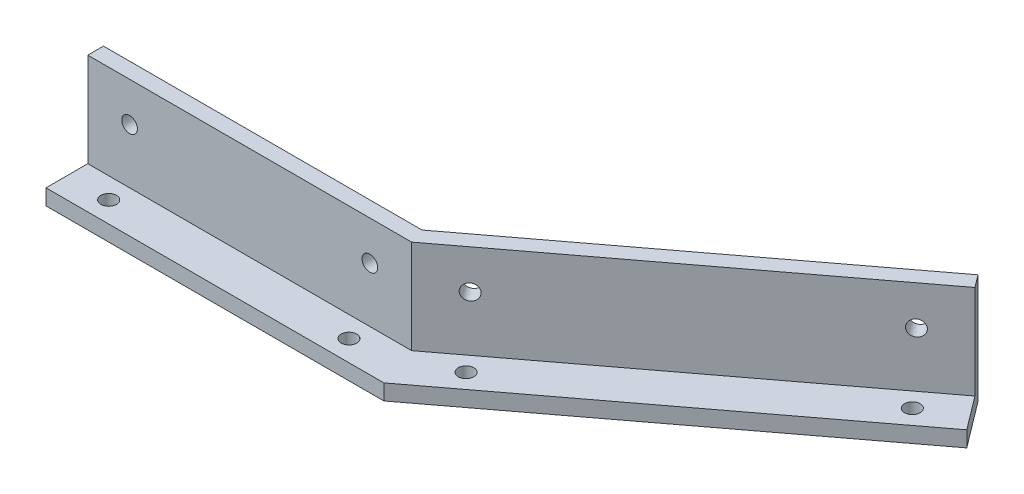
ISO-10303-21;
HEADER;
FILE_DESCRIPTION(('STEP AP214'),'2;1');
FILE_NAME('part.step','',(''),(''),'','','');
FILE_SCHEMA(('AUTOMOTIVE_DESIGN { 1 0 10303 214 1 1 1 1 }'));
ENDSEC;
DATA;
#1=APPLICATION_CONTEXT('core data for automotive mechanical design processes');
#2=APPLICATION_PROTOCOL_DEFINITION('international standard','automotive_design',2000,#1);
#3=PRODUCT_CONTEXT('',#1,'mechanical');
#4=PRODUCT('Part','Part','',(#3));
#5=PRODUCT_RELATED_PRODUCT_CATEGORY('part','',(#4));
#6=PRODUCT_DEFINITION_FORMATION('','',#4);
#7=PRODUCT_DEFINITION_CONTEXT('part definition',#1,'design');
#8=PRODUCT_DEFINITION('design','',#6,#7);
#9=PRODUCT_DEFINITION_SHAPE('','',#8);
#10=(LENGTH_UNIT() NAMED_UNIT(*) SI_UNIT(.MILLI.,.METRE.));
#11=(NAMED_UNIT(*) PLANE_ANGLE_UNIT() SI_UNIT($,.RADIAN.));
#12=(NAMED_UNIT(*) SI_UNIT($,.STERADIAN.) SOLID_ANGLE_UNIT());
#13=UNCERTAINTY_MEASURE_WITH_UNIT(LENGTH_MEASURE(1.E-05),#10,'distance_accuracy_value','');
#14=(GEOMETRIC_REPRESENTATION_CONTEXT(3) GLOBAL_UNCERTAINTY_ASSIGNED_CONTEXT((#13)) GLOBAL_UNIT_ASSIGNED_CONTEXT((#10,
#11,#12)) REPRESENTATION_CONTEXT('',''));
#15=CARTESIAN_POINT('',(0.,0.,0.));
#16=DIRECTION('',(0.,0.,1.));
#17=DIRECTION('',(1.,0.,0.));
#18=AXIS2_PLACEMENT_3D('',#15,#16,#17);
#19=CARTESIAN_POINT('',(0.,3.,0.));
#20=DIRECTION('',(1.,0.,0.));
#21=DIRECTION('',(0.,0.,-1.));
#22=AXIS2_PLACEMENT_3D('',#19,#20,#21);
#23=PLANE('',#22);
#24=DIRECTION('',(0.,0.,1.));
#25=VECTOR('',#24,1.);
#26=CARTESIAN_POINT('',(0.,0.,0.));
#27=LINE('',#26,#25);
#28=CARTESIAN_POINT('',(0.,0.,-3.));
#29=VERTEX_POINT('',#28);
#30=CARTESIAN_POINT('',(0.,0.,8.));
#31=VERTEX_POINT('',#30);
#32=EDGE_CURVE('E135',#29,#31,#27,.T.);
#33=ORIENTED_EDGE('',*,*,#32,.T.);
#34=DIRECTION('',(0.,-1.,0.));
#35=VECTOR('',#34,1.);
#36=CARTESIAN_POINT('',(0.,3.,8.));
#37=LINE('',#36,#35);
#38=CARTESIAN_POINT('',(0.,3.,8.));
#39=VERTEX_POINT('',#38);
#40=EDGE_CURVE('E11',#39,#31,#37,.T.);
#41=ORIENTED_EDGE('',*,*,#40,.F.);
#42=DIRECTION('',(0.,0.,1.));
#43=VECTOR('',#42,1.);
#44=CARTESIAN_POINT('',(0.,3.,0.));
#45=LINE('',#44,#43);
#46=CARTESIAN_POINT('',(0.,3.,0.));
#47=VERTEX_POINT('',#46);
#48=EDGE_CURVE('E144',#47,#39,#45,.T.);
#49=ORIENTED_EDGE('',*,*,#48,.F.);
#50=DIRECTION('',(0.,-1.,0.));
#51=VECTOR('',#50,1.);
#52=CARTESIAN_POINT('',(0.,21.,0.));
#53=LINE('',#52,#51);
#54=CARTESIAN_POINT('',(0.,21.,0.));
#55=VERTEX_POINT('',#54);
#56=EDGE_CURVE('E192',#55,#47,#53,.T.);
#57=ORIENTED_EDGE('',*,*,#56,.F.);
#58=DIRECTION('',(0.,0.,1.));
#59=VECTOR('',#58,1.);
#60=CARTESIAN_POINT('',(0.,21.,0.));
#61=LINE('',#60,#59);
#62=CARTESIAN_POINT('',(0.,21.,-3.));
#63=VERTEX_POINT('',#62);
#64=EDGE_CURVE('E184',#63,#55,#61,.T.);
#65=ORIENTED_EDGE('',*,*,#64,.F.);
#66=DIRECTION('',(0.,-1.,0.));
#67=VECTOR('',#66,1.);
#68=CARTESIAN_POINT('',(0.,21.,-3.));
#69=LINE('',#68,#67);
#70=EDGE_CURVE('E195',#63,#29,#69,.T.);
#71=ORIENTED_EDGE('',*,*,#70,.T.);
#72=EDGE_LOOP('',(#33,#41,#49,#57,#65,#71));
#73=FACE_BOUND('',#72,.T.);
#74=ADVANCED_FACE('F35',(#73),#23,.F.);
#75=CARTESIAN_POINT('',(0.,3.,8.));
#76=DIRECTION('',(0.,0.,-1.));
#77=DIRECTION('',(-1.,0.,0.));
#78=AXIS2_PLACEMENT_3D('',#75,#76,#77);
#79=PLANE('',#78);
#80=DIRECTION('',(1.,0.,0.));
#81=VECTOR('',#80,1.);
#82=CARTESIAN_POINT('',(0.,0.,8.));
#83=LINE('',#82,#81);
#84=CARTESIAN_POINT('',(64.6810803346857,0.,8.));
#85=VERTEX_POINT('',#84);
#86=EDGE_CURVE('E64',#31,#85,#83,.T.);
#87=ORIENTED_EDGE('',*,*,#86,.T.);
#88=DIRECTION('',(0.,-1.,0.));
#89=VECTOR('',#88,1.);
#90=CARTESIAN_POINT('',(64.6810803346857,3.,8.));
#91=LINE('',#90,#89);
#92=CARTESIAN_POINT('',(64.6810803346857,3.,8.));
#93=VERTEX_POINT('',#92);
#94=EDGE_CURVE('E43',#93,#85,#91,.T.);
#95=ORIENTED_EDGE('',*,*,#94,.F.);
#96=DIRECTION('',(1.,0.,0.));
#97=VECTOR('',#96,1.);
#98=CARTESIAN_POINT('',(0.,3.,8.));
#99=LINE('',#98,#97);
#100=EDGE_CURVE('E77',#39,#93,#99,.T.);
#101=ORIENTED_EDGE('',*,*,#100,.F.);
#102=ORIENTED_EDGE('',*,*,#40,.T.);
#103=EDGE_LOOP('',(#87,#95,#101,#102));
#104=FACE_BOUND('',#103,.T.);
#105=ADVANCED_FACE('F242',(#104),#79,.F.);
#106=CARTESIAN_POINT('',(64.6810803346857,3.,8.));
#107=DIRECTION('',(-0.602589900007111,0.,-0.798051008651339));
#108=DIRECTION('',(-0.798051008651339,0.,0.602589900007111));
#109=AXIS2_PLACEMENT_3D('',#106,#107,#108);
#110=PLANE('',#109);
#111=DIRECTION('',(0.798051008651339,0.,-0.602589900007111));
#112=VECTOR('',#111,1.);
#113=CARTESIAN_POINT('',(64.6810803346857,0.,8.));
#114=LINE('',#113,#112);
#115=CARTESIAN_POINT('',(128.27064686621,0.,-40.0150142313369));
#116=VERTEX_POINT('',#115);
#117=EDGE_CURVE('E71',#85,#116,#114,.T.);
#118=ORIENTED_EDGE('',*,*,#117,.T.);
#119=DIRECTION('',(0.,-1.,0.));
#120=VECTOR('',#119,1.);
#121=CARTESIAN_POINT('',(128.27064686621,3.,-40.0150142313369));
#122=LINE('',#121,#120);
#123=CARTESIAN_POINT('',(128.27064686621,3.,-40.0150142313369));
#124=VERTEX_POINT('',#123);
#125=EDGE_CURVE('E150',#124,#116,#122,.T.);
#126=ORIENTED_EDGE('',*,*,#125,.F.);
#127=DIRECTION('',(0.798051008651339,0.,-0.602589900007111));
#128=VECTOR('',#127,1.);
#129=CARTESIAN_POINT('',(64.6810803346857,3.,8.));
#130=LINE('',#129,#128);
#131=EDGE_CURVE('E91',#93,#124,#130,.T.);
#132=ORIENTED_EDGE('',*,*,#131,.F.);
#133=ORIENTED_EDGE('',*,*,#94,.T.);
#134=EDGE_LOOP('',(#118,#126,#132,#133));
#135=FACE_BOUND('',#134,.T.);
#136=ADVANCED_FACE('F156',(#135),#110,.F.);
#137=CARTESIAN_POINT('',(128.27064686621,3.,-40.0150142313369));
#138=DIRECTION('',(-0.798051008651335,0.,0.602589900007116));
#139=DIRECTION('',(0.602589900007117,0.,0.798051008651335));
#140=AXIS2_PLACEMENT_3D('',#137,#138,#139);
#141=PLANE('',#140);
#142=DIRECTION('',(-0.602589900007116,0.,-0.798051008651335));
#143=VECTOR('',#142,1.);
#144=CARTESIAN_POINT('',(128.27064686621,0.,-40.0150142313369));
#145=LINE('',#144,#143);
#146=CARTESIAN_POINT('',(121.642157966132,0.,-48.7935753265016));
#147=VERTEX_POINT('',#146);
#148=EDGE_CURVE('E146',#116,#147,#145,.T.);
#149=ORIENTED_EDGE('',*,*,#148,.T.);
#150=DIRECTION('',(0.,-1.,0.));
#151=VECTOR('',#150,1.);
#152=CARTESIAN_POINT('',(121.642157966132,21.,-48.7935753265016));
#153=LINE('',#152,#151);
#154=CARTESIAN_POINT('',(121.642157966132,21.,-48.7935753265016));
#155=VERTEX_POINT('',#154);
#156=EDGE_CURVE('E111',#155,#147,#153,.T.);
#157=ORIENTED_EDGE('',*,*,#156,.F.);
#158=DIRECTION('',(-0.602589900007116,0.,-0.798051008651335));
#159=VECTOR('',#158,1.);
#160=CARTESIAN_POINT('',(123.449927666153,21.,-46.3994223005476));
#161=LINE('',#160,#159);
#162=CARTESIAN_POINT('',(123.449927666153,21.,-46.3994223005476));
#163=VERTEX_POINT('',#162);
#164=EDGE_CURVE('E110',#163,#155,#161,.T.);
#165=ORIENTED_EDGE('',*,*,#164,.F.);
#166=DIRECTION('',(0.,-1.,0.));
#167=VECTOR('',#166,1.);
#168=CARTESIAN_POINT('',(123.449927666153,21.,-46.3994223005476));
#169=LINE('',#168,#167);
#170=CARTESIAN_POINT('',(123.449927666153,3.,-46.3994223005476));
#171=VERTEX_POINT('',#170);
#172=EDGE_CURVE('E101',#163,#171,#169,.T.);
#173=ORIENTED_EDGE('',*,*,#172,.T.);
#174=DIRECTION('',(-0.602589900007116,0.,-0.798051008651335));
#175=VECTOR('',#174,1.);
#176=CARTESIAN_POINT('',(128.27064686621,3.,-40.0150142313369));
#177=LINE('',#176,#175);
#178=EDGE_CURVE('E86',#124,#171,#177,.T.);
#179=ORIENTED_EDGE('',*,*,#178,.F.);
#180=ORIENTED_EDGE('',*,*,#125,.T.);
#181=EDGE_LOOP('',(#149,#157,#165,#173,#179,#180));
#182=FACE_BOUND('',#181,.T.);
#183=ADVANCED_FACE('F107',(#182),#141,.F.);
#184=CARTESIAN_POINT('',(0.,3.,0.));
#185=DIRECTION('',(0.,1.,0.));
#186=DIRECTION('',(0.,0.,1.));
#187=AXIS2_PLACEMENT_3D('',#184,#185,#186);
#188=PLANE('',#187);
#189=CARTESIAN_POINT('',(70.7947676692392,3.,-1.62851516545155));
#190=DIRECTION('',(0.,1.,0.));
#191=DIRECTION('',(0.,0.,1.));
#192=AXIS2_PLACEMENT_3D('',#189,#190,#191);
#193=CIRCLE('',#192,1.5);
#194=CARTESIAN_POINT('',(70.7947676692392,3.,-0.128515165451554));
#195=VERTEX_POINT('',#194);
#196=EDGE_CURVE('E124',#195,#195,#193,.T.);
#197=ORIENTED_EDGE('',*,*,#196,.F.);
#198=EDGE_LOOP('',(#197));
#199=FACE_BOUND('',#198,.T.);
#200=CARTESIAN_POINT('',(119.475879196971,3.,-38.3864990658853));
#201=DIRECTION('',(0.,1.,0.));
#202=DIRECTION('',(0.,0.,1.));
#203=AXIS2_PLACEMENT_3D('',#200,#201,#202);
#204=CIRCLE('',#203,1.5);
#205=CARTESIAN_POINT('',(119.475879196971,3.,-36.8864990658853));
#206=VERTEX_POINT('',#205);
#207=EDGE_CURVE('E113',#206,#206,#204,.T.);
#208=ORIENTED_EDGE('',*,*,#207,.F.);
#209=EDGE_LOOP('',(#208));
#210=FACE_BOUND('',#209,.T.);
#211=CARTESIAN_POINT('',(8.,3.,4.));
#212=DIRECTION('',(0.,1.,0.));
#213=DIRECTION('',(0.,0.,1.));
#214=AXIS2_PLACEMENT_3D('',#211,#212,#213);
#215=CIRCLE('',#214,1.5);
#216=CARTESIAN_POINT('',(8.,3.,5.5));
#217=VERTEX_POINT('',#216);
#218=EDGE_CURVE('E136',#217,#217,#215,.T.);
#219=ORIENTED_EDGE('',*,*,#218,.F.);
#220=EDGE_LOOP('',(#219));
#221=FACE_BOUND('',#220,.T.);
#222=CARTESIAN_POINT('',(54.,3.,4.));
#223=DIRECTION('',(0.,1.,0.));
#224=DIRECTION('',(0.,0.,1.));
#225=AXIS2_PLACEMENT_3D('',#222,#223,#224);
#226=CIRCLE('',#225,1.5);
#227=CARTESIAN_POINT('',(54.,3.,5.5));
#228=VERTEX_POINT('',#227);
#229=EDGE_CURVE('E123',#228,#228,#226,.T.);
#230=ORIENTED_EDGE('',*,*,#229,.F.);
#231=EDGE_LOOP('',(#230));
#232=FACE_BOUND('',#231,.T.);
#233=ORIENTED_EDGE('',*,*,#48,.T.);
#234=ORIENTED_EDGE('',*,*,#100,.T.);
#235=ORIENTED_EDGE('',*,*,#131,.T.);
#236=ORIENTED_EDGE('',*,*,#178,.T.);
#237=DIRECTION('',(-0.798051008651339,0.,0.602589900007111));
#238=VECTOR('',#237,1.);
#239=CARTESIAN_POINT('',(62.,3.,0.));
#240=LINE('',#239,#238);
#241=CARTESIAN_POINT('',(62.,3.,0.));
#242=VERTEX_POINT('',#241);
#243=EDGE_CURVE('E89',#171,#242,#240,.T.);
#244=ORIENTED_EDGE('',*,*,#243,.T.);
#245=DIRECTION('',(-1.,0.,0.));
#246=VECTOR('',#245,1.);
#247=CARTESIAN_POINT('',(0.,3.,0.));
#248=LINE('',#247,#246);
#249=EDGE_CURVE('E51',#242,#47,#248,.T.);
#250=ORIENTED_EDGE('',*,*,#249,.T.);
#251=EDGE_LOOP('',(#233,#234,#235,#236,#244,#250));
#252=FACE_BOUND('',#251,.T.);
#253=ADVANCED_FACE('F88',(#199,#210,#221,#232,#252),#188,.T.);
#254=CARTESIAN_POINT('',(0.,0.,0.));
#255=DIRECTION('',(0.,1.,0.));
#256=DIRECTION('',(0.,0.,1.));
#257=AXIS2_PLACEMENT_3D('',#254,#255,#256);
#258=PLANE('',#257);
#259=ORIENTED_EDGE('',*,*,#32,.F.);
#260=DIRECTION('',(-1.,0.,0.));
#261=VECTOR('',#260,1.);
#262=CARTESIAN_POINT('',(0.,0.,-3.));
#263=LINE('',#262,#261);
#264=CARTESIAN_POINT('',(60.9945948744929,0.,-3.));
#265=VERTEX_POINT('',#264);
#266=EDGE_CURVE('E202',#265,#29,#263,.T.);
#267=ORIENTED_EDGE('',*,*,#266,.F.);
#268=DIRECTION('',(-0.798051008651339,0.,0.602589900007111));
#269=VECTOR('',#268,1.);
#270=CARTESIAN_POINT('',(121.642157966132,0.,-48.7935753265016));
#271=LINE('',#270,#269);
#272=EDGE_CURVE('E166',#147,#265,#271,.T.);
#273=ORIENTED_EDGE('',*,*,#272,.F.);
#274=ORIENTED_EDGE('',*,*,#148,.F.);
#275=ORIENTED_EDGE('',*,*,#117,.F.);
#276=ORIENTED_EDGE('',*,*,#86,.F.);
#277=EDGE_LOOP('',(#259,#267,#273,#274,#275,#276));
#278=FACE_BOUND('',#277,.T.);
#279=CARTESIAN_POINT('',(70.7947676692392,0.,-1.62851516545155));
#280=DIRECTION('',(0.,1.,0.));
#281=DIRECTION('',(0.,0.,1.));
#282=AXIS2_PLACEMENT_3D('',#279,#280,#281);
#283=CIRCLE('',#282,1.5);
#284=CARTESIAN_POINT('',(70.7947676692392,0.,-0.128515165451554));
#285=VERTEX_POINT('',#284);
#286=EDGE_CURVE('E120',#285,#285,#283,.T.);
#287=ORIENTED_EDGE('',*,*,#286,.T.);
#288=EDGE_LOOP('',(#287));
#289=FACE_BOUND('',#288,.T.);
#290=CARTESIAN_POINT('',(119.475879196971,0.,-38.3864990658853));
#291=DIRECTION('',(0.,1.,0.));
#292=DIRECTION('',(0.,0.,1.));
#293=AXIS2_PLACEMENT_3D('',#290,#291,#292);
#294=CIRCLE('',#293,1.5);
#295=CARTESIAN_POINT('',(119.475879196971,0.,-36.8864990658853));
#296=VERTEX_POINT('',#295);
#297=EDGE_CURVE('E127',#296,#296,#294,.T.);
#298=ORIENTED_EDGE('',*,*,#297,.T.);
#299=EDGE_LOOP('',(#298));
#300=FACE_BOUND('',#299,.T.);
#301=CARTESIAN_POINT('',(8.,0.,4.));
#302=DIRECTION('',(0.,1.,0.));
#303=DIRECTION('',(0.,0.,1.));
#304=AXIS2_PLACEMENT_3D('',#301,#302,#303);
#305=CIRCLE('',#304,1.5);
#306=CARTESIAN_POINT('',(8.,0.,5.5));
#307=VERTEX_POINT('',#306);
#308=EDGE_CURVE('E132',#307,#307,#305,.T.);
#309=ORIENTED_EDGE('',*,*,#308,.T.);
#310=EDGE_LOOP('',(#309));
#311=FACE_BOUND('',#310,.T.);
#312=CARTESIAN_POINT('',(54.,0.,4.));
#313=DIRECTION('',(0.,1.,0.));
#314=DIRECTION('',(0.,0.,1.));
#315=AXIS2_PLACEMENT_3D('',#312,#313,#314);
#316=CIRCLE('',#315,1.5);
#317=CARTESIAN_POINT('',(54.,0.,5.5));
#318=VERTEX_POINT('',#317);
#319=EDGE_CURVE('E139',#318,#318,#316,.T.);
#320=ORIENTED_EDGE('',*,*,#319,.T.);
#321=EDGE_LOOP('',(#320));
#322=FACE_BOUND('',#321,.T.);
#323=ADVANCED_FACE('F160',(#278,#289,#300,#311,#322),#258,.F.);
#324=CARTESIAN_POINT('',(54.,0.,4.));
#325=DIRECTION('',(0.,1.,0.));
#326=DIRECTION('',(0.,0.,1.));
#327=AXIS2_PLACEMENT_3D('',#324,#325,#326);
#328=CYLINDRICAL_SURFACE('',#327,1.5);
#329=ORIENTED_EDGE('',*,*,#319,.F.);
#330=EDGE_LOOP('',(#329));
#331=FACE_BOUND('',#330,.T.);
#332=ORIENTED_EDGE('',*,*,#229,.T.);
#333=EDGE_LOOP('',(#332));
#334=FACE_BOUND('',#333,.T.);
#335=ADVANCED_FACE('F255',(#331,#334),#328,.F.);
#336=CARTESIAN_POINT('',(8.,0.,4.));
#337=DIRECTION('',(0.,1.,0.));
#338=DIRECTION('',(0.,0.,1.));
#339=AXIS2_PLACEMENT_3D('',#336,#337,#338);
#340=CYLINDRICAL_SURFACE('',#339,1.5);
#341=ORIENTED_EDGE('',*,*,#308,.F.);
#342=EDGE_LOOP('',(#341));
#343=FACE_BOUND('',#342,.T.);
#344=ORIENTED_EDGE('',*,*,#218,.T.);
#345=EDGE_LOOP('',(#344));
#346=FACE_BOUND('',#345,.T.);
#347=ADVANCED_FACE('F261',(#343,#346),#340,.F.);
#348=CARTESIAN_POINT('',(119.475879196971,0.,-38.3864990658853));
#349=DIRECTION('',(0.,1.,0.));
#350=DIRECTION('',(0.,0.,1.));
#351=AXIS2_PLACEMENT_3D('',#348,#349,#350);
#352=CYLINDRICAL_SURFACE('',#351,1.5);
#353=ORIENTED_EDGE('',*,*,#297,.F.);
#354=EDGE_LOOP('',(#353));
#355=FACE_BOUND('',#354,.T.);
#356=ORIENTED_EDGE('',*,*,#207,.T.);
#357=EDGE_LOOP('',(#356));
#358=FACE_BOUND('',#357,.T.);
#359=ADVANCED_FACE('F236',(#355,#358),#352,.F.);
#360=CARTESIAN_POINT('',(70.7947676692392,0.,-1.62851516545155));
#361=DIRECTION('',(0.,1.,0.));
#362=DIRECTION('',(0.,0.,1.));
#363=AXIS2_PLACEMENT_3D('',#360,#361,#362);
#364=CYLINDRICAL_SURFACE('',#363,1.5);
#365=ORIENTED_EDGE('',*,*,#286,.F.);
#366=EDGE_LOOP('',(#365));
#367=FACE_BOUND('',#366,.T.);
#368=ORIENTED_EDGE('',*,*,#196,.T.);
#369=EDGE_LOOP('',(#368));
#370=FACE_BOUND('',#369,.T.);
#371=ADVANCED_FACE('F227',(#367,#370),#364,.F.);
#372=CARTESIAN_POINT('',(0.,21.,0.));
#373=DIRECTION('',(0.,0.,-1.));
#374=DIRECTION('',(-1.,0.,0.));
#375=AXIS2_PLACEMENT_3D('',#372,#373,#374);
#376=PLANE('',#375);
#377=CARTESIAN_POINT('',(8.,13.5,0.));
#378=DIRECTION('',(0.,0.,1.));
#379=DIRECTION('',(1.,0.,0.));
#380=AXIS2_PLACEMENT_3D('',#377,#378,#379);
#381=CIRCLE('',#380,1.5);
#382=CARTESIAN_POINT('',(9.5,13.5,0.));
#383=VERTEX_POINT('',#382);
#384=EDGE_CURVE('E415',#383,#383,#381,.T.);
#385=ORIENTED_EDGE('',*,*,#384,.F.);
#386=EDGE_LOOP('',(#385));
#387=FACE_BOUND('',#386,.T.);
#388=CARTESIAN_POINT('',(54.,13.5,0.));
#389=DIRECTION('',(0.,0.,1.));
#390=DIRECTION('',(1.,0.,0.));
#391=AXIS2_PLACEMENT_3D('',#388,#389,#390);
#392=CIRCLE('',#391,1.5);
#393=CARTESIAN_POINT('',(55.5,13.5,0.));
#394=VERTEX_POINT('',#393);
#395=EDGE_CURVE('E405',#394,#394,#392,.T.);
#396=ORIENTED_EDGE('',*,*,#395,.F.);
#397=EDGE_LOOP('',(#396));
#398=FACE_BOUND('',#397,.T.);
#399=ORIENTED_EDGE('',*,*,#249,.F.);
#400=DIRECTION('',(0.,-1.,0.));
#401=VECTOR('',#400,1.);
#402=CARTESIAN_POINT('',(62.,21.,0.));
#403=LINE('',#402,#401);
#404=CARTESIAN_POINT('',(62.,21.,0.));
#405=VERTEX_POINT('',#404);
#406=EDGE_CURVE('E104',#405,#242,#403,.T.);
#407=ORIENTED_EDGE('',*,*,#406,.F.);
#408=DIRECTION('',(1.,0.,0.));
#409=VECTOR('',#408,1.);
#410=CARTESIAN_POINT('',(0.,21.,0.));
#411=LINE('',#410,#409);
#412=EDGE_CURVE('E204',#55,#405,#411,.T.);
#413=ORIENTED_EDGE('',*,*,#412,.F.);
#414=ORIENTED_EDGE('',*,*,#56,.T.);
#415=EDGE_LOOP('',(#399,#407,#413,#414));
#416=FACE_BOUND('',#415,.T.);
#417=ADVANCED_FACE('F225',(#387,#398,#416),#376,.F.);
#418=CARTESIAN_POINT('',(62.,21.,0.));
#419=DIRECTION('',(-0.602589900007111,0.,-0.798051008651339));
#420=DIRECTION('',(-0.798051008651339,0.,0.602589900007111));
#421=AXIS2_PLACEMENT_3D('',#418,#419,#420);
#422=PLANE('',#421);
#423=CARTESIAN_POINT('',(68.3844080692107,13.5,-4.8207192000569));
#424=DIRECTION('',(0.602589900007111,0.,0.798051008651339));
#425=DIRECTION('',(0.798051008651339,0.,-0.602589900007111));
#426=AXIS2_PLACEMENT_3D('',#423,#424,#425);
#427=CIRCLE('',#426,1.5);
#428=CARTESIAN_POINT('',(69.5814845821877,13.5,-5.72460405006756));
#429=VERTEX_POINT('',#428);
#430=EDGE_CURVE('E402',#429,#429,#427,.T.);
#431=ORIENTED_EDGE('',*,*,#430,.F.);
#432=EDGE_LOOP('',(#431));
#433=FACE_BOUND('',#432,.T.);
#434=CARTESIAN_POINT('',(117.065519596942,13.5,-41.5787031004907));
#435=DIRECTION('',(0.602589900007111,0.,0.798051008651339));
#436=DIRECTION('',(0.798051008651339,0.,-0.602589900007111));
#437=AXIS2_PLACEMENT_3D('',#434,#435,#436);
#438=CIRCLE('',#437,1.5);
#439=CARTESIAN_POINT('',(118.262596109919,13.5,-42.4825879505013));
#440=VERTEX_POINT('',#439);
#441=EDGE_CURVE('E408',#440,#440,#438,.T.);
#442=ORIENTED_EDGE('',*,*,#441,.F.);
#443=EDGE_LOOP('',(#442));
#444=FACE_BOUND('',#443,.T.);
#445=ORIENTED_EDGE('',*,*,#243,.F.);
#446=ORIENTED_EDGE('',*,*,#172,.F.);
#447=DIRECTION('',(0.798051008651339,0.,-0.602589900007111));
#448=VECTOR('',#447,1.);
#449=CARTESIAN_POINT('',(62.,21.,0.));
#450=LINE('',#449,#448);
#451=EDGE_CURVE('E186',#405,#163,#450,.T.);
#452=ORIENTED_EDGE('',*,*,#451,.F.);
#453=ORIENTED_EDGE('',*,*,#406,.T.);
#454=EDGE_LOOP('',(#445,#446,#452,#453));
#455=FACE_BOUND('',#454,.T.);
#456=ADVANCED_FACE('F98',(#433,#444,#455),#422,.F.);
#457=CARTESIAN_POINT('',(121.642157966132,21.,-48.7935753265016));
#458=DIRECTION('',(0.602589900007111,0.,0.798051008651339));
#459=DIRECTION('',(0.798051008651339,0.,-0.602589900007111));
#460=AXIS2_PLACEMENT_3D('',#457,#458,#459);
#461=PLANE('',#460);
#462=CARTESIAN_POINT('',(66.5766383691894,13.5,-7.21487222601091));
#463=DIRECTION('',(0.602589900007111,0.,0.798051008651339));
#464=DIRECTION('',(0.798051008651339,0.,-0.602589900007111));
#465=AXIS2_PLACEMENT_3D('',#462,#463,#464);
#466=CIRCLE('',#465,1.5);
#467=CARTESIAN_POINT('',(67.7737148821664,13.5,-8.11875707602158));
#468=VERTEX_POINT('',#467);
#469=EDGE_CURVE('E399',#468,#468,#466,.T.);
#470=ORIENTED_EDGE('',*,*,#469,.T.);
#471=EDGE_LOOP('',(#470));
#472=FACE_BOUND('',#471,.T.);
#473=CARTESIAN_POINT('',(115.257749896921,13.5,-43.9728561264447));
#474=DIRECTION('',(0.602589900007111,0.,0.798051008651339));
#475=DIRECTION('',(0.798051008651339,0.,-0.602589900007111));
#476=AXIS2_PLACEMENT_3D('',#473,#474,#475);
#477=CIRCLE('',#476,1.5);
#478=CARTESIAN_POINT('',(116.454826409898,13.5,-44.8767409764554));
#479=VERTEX_POINT('',#478);
#480=EDGE_CURVE('E403',#479,#479,#477,.T.);
#481=ORIENTED_EDGE('',*,*,#480,.T.);
#482=EDGE_LOOP('',(#481));
#483=FACE_BOUND('',#482,.T.);
#484=ORIENTED_EDGE('',*,*,#156,.T.);
#485=ORIENTED_EDGE('',*,*,#272,.T.);
#486=DIRECTION('',(0.,-1.,0.));
#487=VECTOR('',#486,1.);
#488=CARTESIAN_POINT('',(60.9945948744929,21.,-3.));
#489=LINE('',#488,#487);
#490=CARTESIAN_POINT('',(60.9945948744929,21.,-3.));
#491=VERTEX_POINT('',#490);
#492=EDGE_CURVE('E116',#491,#265,#489,.T.);
#493=ORIENTED_EDGE('',*,*,#492,.F.);
#494=DIRECTION('',(-0.798051008651339,0.,0.602589900007111));
#495=VECTOR('',#494,1.);
#496=CARTESIAN_POINT('',(121.642157966132,21.,-48.7935753265016));
#497=LINE('',#496,#495);
#498=EDGE_CURVE('E175',#155,#491,#497,.T.);
#499=ORIENTED_EDGE('',*,*,#498,.F.);
#500=EDGE_LOOP('',(#484,#485,#493,#499));
#501=FACE_BOUND('',#500,.T.);
#502=ADVANCED_FACE('F172',(#472,#483,#501),#461,.F.);
#503=CARTESIAN_POINT('',(0.,21.,-3.));
#504=DIRECTION('',(0.,0.,1.));
#505=DIRECTION('',(1.,0.,0.));
#506=AXIS2_PLACEMENT_3D('',#503,#504,#505);
#507=PLANE('',#506);
#508=CARTESIAN_POINT('',(8.,13.5,-3.));
#509=DIRECTION('',(0.,0.,1.));
#510=DIRECTION('',(1.,0.,0.));
#511=AXIS2_PLACEMENT_3D('',#508,#509,#510);
#512=CIRCLE('',#511,1.5);
#513=CARTESIAN_POINT('',(9.5,13.5,-3.));
#514=VERTEX_POINT('',#513);
#515=EDGE_CURVE('E208',#514,#514,#512,.T.);
#516=ORIENTED_EDGE('',*,*,#515,.T.);
#517=EDGE_LOOP('',(#516));
#518=FACE_BOUND('',#517,.T.);
#519=CARTESIAN_POINT('',(54.,13.5,-3.));
#520=DIRECTION('',(0.,0.,1.));
#521=DIRECTION('',(1.,0.,0.));
#522=AXIS2_PLACEMENT_3D('',#519,#520,#521);
#523=CIRCLE('',#522,1.5);
#524=CARTESIAN_POINT('',(55.5,13.5,-3.));
#525=VERTEX_POINT('',#524);
#526=EDGE_CURVE('E418',#525,#525,#523,.T.);
#527=ORIENTED_EDGE('',*,*,#526,.T.);
#528=EDGE_LOOP('',(#527));
#529=FACE_BOUND('',#528,.T.);
#530=ORIENTED_EDGE('',*,*,#492,.T.);
#531=ORIENTED_EDGE('',*,*,#266,.T.);
#532=ORIENTED_EDGE('',*,*,#70,.F.);
#533=DIRECTION('',(-1.,0.,0.));
#534=VECTOR('',#533,1.);
#535=CARTESIAN_POINT('',(0.,21.,-3.));
#536=LINE('',#535,#534);
#537=EDGE_CURVE('E182',#491,#63,#536,.T.);
#538=ORIENTED_EDGE('',*,*,#537,.F.);
#539=EDGE_LOOP('',(#530,#531,#532,#538));
#540=FACE_BOUND('',#539,.T.);
#541=ADVANCED_FACE('F199',(#518,#529,#540),#507,.F.);
#542=CARTESIAN_POINT('',(0.,21.,0.));
#543=DIRECTION('',(0.,1.,0.));
#544=DIRECTION('',(0.,0.,1.));
#545=AXIS2_PLACEMENT_3D('',#542,#543,#544);
#546=PLANE('',#545);
#547=ORIENTED_EDGE('',*,*,#412,.T.);
#548=ORIENTED_EDGE('',*,*,#451,.T.);
#549=ORIENTED_EDGE('',*,*,#164,.T.);
#550=ORIENTED_EDGE('',*,*,#498,.T.);
#551=ORIENTED_EDGE('',*,*,#537,.T.);
#552=ORIENTED_EDGE('',*,*,#64,.T.);
#553=EDGE_LOOP('',(#547,#548,#549,#550,#551,#552));
#554=FACE_BOUND('',#553,.T.);
#555=ADVANCED_FACE('F212',(#554),#546,.T.);
#556=CARTESIAN_POINT('',(54.,13.5,-3.));
#557=DIRECTION('',(0.,0.,1.));
#558=DIRECTION('',(1.,0.,0.));
#559=AXIS2_PLACEMENT_3D('',#556,#557,#558);
#560=CYLINDRICAL_SURFACE('',#559,1.5);
#561=ORIENTED_EDGE('',*,*,#526,.F.);
#562=EDGE_LOOP('',(#561));
#563=FACE_BOUND('',#562,.T.);
#564=ORIENTED_EDGE('',*,*,#395,.T.);
#565=EDGE_LOOP('',(#564));
#566=FACE_BOUND('',#565,.T.);
#567=ADVANCED_FACE('F325',(#563,#566),#560,.F.);
#568=CARTESIAN_POINT('',(8.,13.5,-3.));
#569=DIRECTION('',(0.,0.,1.));
#570=DIRECTION('',(1.,0.,0.));
#571=AXIS2_PLACEMENT_3D('',#568,#569,#570);
#572=CYLINDRICAL_SURFACE('',#571,1.5);
#573=ORIENTED_EDGE('',*,*,#515,.F.);
#574=EDGE_LOOP('',(#573));
#575=FACE_BOUND('',#574,.T.);
#576=ORIENTED_EDGE('',*,*,#384,.T.);
#577=EDGE_LOOP('',(#576));
#578=FACE_BOUND('',#577,.T.);
#579=ADVANCED_FACE('F350',(#575,#578),#572,.F.);
#580=CARTESIAN_POINT('',(115.257749896921,13.5,-43.9728561264447));
#581=DIRECTION('',(0.602589900007111,0.,0.798051008651339));
#582=DIRECTION('',(0.798051008651339,0.,-0.602589900007111));
#583=AXIS2_PLACEMENT_3D('',#580,#581,#582);
#584=CYLINDRICAL_SURFACE('',#583,1.5);
#585=ORIENTED_EDGE('',*,*,#480,.F.);
#586=EDGE_LOOP('',(#585));
#587=FACE_BOUND('',#586,.T.);
#588=ORIENTED_EDGE('',*,*,#441,.T.);
#589=EDGE_LOOP('',(#588));
#590=FACE_BOUND('',#589,.T.);
#591=ADVANCED_FACE('F360',(#587,#590),#584,.F.);
#592=CARTESIAN_POINT('',(66.5766383691894,13.5,-7.21487222601091));
#593=DIRECTION('',(0.602589900007111,0.,0.798051008651339));
#594=DIRECTION('',(0.798051008651339,0.,-0.602589900007111));
#595=AXIS2_PLACEMENT_3D('',#592,#593,#594);
#596=CYLINDRICAL_SURFACE('',#595,1.5);
#597=ORIENTED_EDGE('',*,*,#469,.F.);
#598=EDGE_LOOP('',(#597));
#599=FACE_BOUND('',#598,.T.);
#600=ORIENTED_EDGE('',*,*,#430,.T.);
#601=EDGE_LOOP('',(#600));
#602=FACE_BOUND('',#601,.T.);
#603=ADVANCED_FACE('F382',(#599,#602),#596,.F.);
#604=CLOSED_SHELL('',(#74,#105,#136,#183,#253,#323,#335,#347,#359,#371,#417,#456,#502,#541,#555,
#567,#579,#591,#603));
#605=MANIFOLD_SOLID_BREP('B2',#604);
#606=ADVANCED_BREP_SHAPE_REPRESENTATION('',(#18,#605),#14);
#607=SHAPE_DEFINITION_REPRESENTATION(#9,#606);
ENDSEC;
END-ISO-10303-21;
